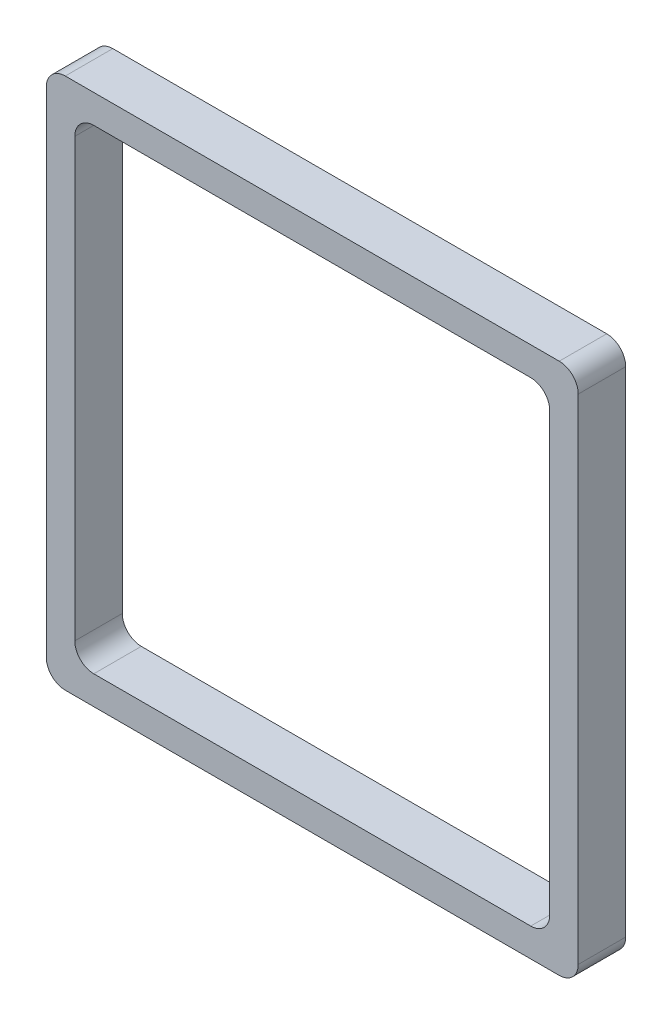
ISO-10303-21;
HEADER;
FILE_DESCRIPTION(('STEP AP214'),'2;1');
FILE_NAME('part.step','',(''),(''),'','','');
FILE_SCHEMA(('AUTOMOTIVE_DESIGN { 1 0 10303 214 1 1 1 1 }'));
ENDSEC;
DATA;
#1=APPLICATION_CONTEXT('core data for automotive mechanical design processes');
#2=APPLICATION_PROTOCOL_DEFINITION('international standard','automotive_design',2000,#1);
#3=PRODUCT_CONTEXT('',#1,'mechanical');
#4=PRODUCT('Part','Part','',(#3));
#5=PRODUCT_RELATED_PRODUCT_CATEGORY('part','',(#4));
#6=PRODUCT_DEFINITION_FORMATION('','',#4);
#7=PRODUCT_DEFINITION_CONTEXT('part definition',#1,'design');
#8=PRODUCT_DEFINITION('design','',#6,#7);
#9=PRODUCT_DEFINITION_SHAPE('','',#8);
#10=(LENGTH_UNIT() NAMED_UNIT(*) SI_UNIT(.MILLI.,.METRE.));
#11=(NAMED_UNIT(*) PLANE_ANGLE_UNIT() SI_UNIT($,.RADIAN.));
#12=(NAMED_UNIT(*) SI_UNIT($,.STERADIAN.) SOLID_ANGLE_UNIT());
#13=UNCERTAINTY_MEASURE_WITH_UNIT(LENGTH_MEASURE(1.E-05),#10,'distance_accuracy_value','');
#14=(GEOMETRIC_REPRESENTATION_CONTEXT(3) GLOBAL_UNCERTAINTY_ASSIGNED_CONTEXT((#13)) GLOBAL_UNIT_ASSIGNED_CONTEXT((#10,
#11,#12)) REPRESENTATION_CONTEXT('',''));
#15=CARTESIAN_POINT('',(0.,0.,0.));
#16=DIRECTION('',(0.,0.,1.));
#17=DIRECTION('',(1.,0.,0.));
#18=AXIS2_PLACEMENT_3D('',#15,#16,#17);
#19=CARTESIAN_POINT('',(26.,26.,5.));
#20=DIRECTION('',(0.,0.,-1.));
#21=DIRECTION('',(-1.,0.,0.));
#22=AXIS2_PLACEMENT_3D('',#19,#20,#21);
#23=PLANE('',#22);
#24=CARTESIAN_POINT('',(26.,26.,5.));
#25=DIRECTION('',(0.,0.,1.));
#26=DIRECTION('',(-1.,0.,0.));
#27=AXIS2_PLACEMENT_3D('',#24,#25,#26);
#28=CIRCLE('',#27,1.99999999999999);
#29=CARTESIAN_POINT('',(28.,26.,5.));
#30=VERTEX_POINT('',#29);
#31=CARTESIAN_POINT('',(26.,28.,5.));
#32=VERTEX_POINT('',#31);
#33=EDGE_CURVE('E213',#30,#32,#28,.T.);
#34=ORIENTED_EDGE('',*,*,#33,.T.);
#35=DIRECTION('',(-1.,0.,0.));
#36=VECTOR('',#35,1.);
#37=CARTESIAN_POINT('',(26.,28.,5.));
#38=LINE('',#37,#36);
#39=CARTESIAN_POINT('',(-26.,28.,5.));
#40=VERTEX_POINT('',#39);
#41=EDGE_CURVE('E216',#32,#40,#38,.T.);
#42=ORIENTED_EDGE('',*,*,#41,.T.);
#43=CARTESIAN_POINT('',(-26.,26.,5.));
#44=DIRECTION('',(0.,0.,1.));
#45=DIRECTION('',(-1.,0.,0.));
#46=AXIS2_PLACEMENT_3D('',#43,#44,#45);
#47=CIRCLE('',#46,2.);
#48=CARTESIAN_POINT('',(-28.,26.,5.));
#49=VERTEX_POINT('',#48);
#50=EDGE_CURVE('E219',#40,#49,#47,.T.);
#51=ORIENTED_EDGE('',*,*,#50,.T.);
#52=DIRECTION('',(0.,-1.,0.));
#53=VECTOR('',#52,1.);
#54=CARTESIAN_POINT('',(-28.,-26.,5.));
#55=LINE('',#54,#53);
#56=CARTESIAN_POINT('',(-28.,-26.,5.));
#57=VERTEX_POINT('',#56);
#58=EDGE_CURVE('E221',#49,#57,#55,.T.);
#59=ORIENTED_EDGE('',*,*,#58,.T.);
#60=CARTESIAN_POINT('',(-26.,-26.,5.));
#61=DIRECTION('',(0.,0.,1.));
#62=DIRECTION('',(-1.,0.,0.));
#63=AXIS2_PLACEMENT_3D('',#60,#61,#62);
#64=CIRCLE('',#63,2.);
#65=CARTESIAN_POINT('',(-26.,-28.,5.));
#66=VERTEX_POINT('',#65);
#67=EDGE_CURVE('E223',#57,#66,#64,.T.);
#68=ORIENTED_EDGE('',*,*,#67,.T.);
#69=DIRECTION('',(1.,0.,0.));
#70=VECTOR('',#69,1.);
#71=CARTESIAN_POINT('',(26.,-28.,5.));
#72=LINE('',#71,#70);
#73=CARTESIAN_POINT('',(26.,-28.,5.));
#74=VERTEX_POINT('',#73);
#75=EDGE_CURVE('E225',#66,#74,#72,.T.);
#76=ORIENTED_EDGE('',*,*,#75,.T.);
#77=CARTESIAN_POINT('',(26.,-26.,5.));
#78=DIRECTION('',(0.,0.,1.));
#79=DIRECTION('',(-1.,0.,0.));
#80=AXIS2_PLACEMENT_3D('',#77,#78,#79);
#81=CIRCLE('',#80,2.);
#82=CARTESIAN_POINT('',(28.,-26.,5.));
#83=VERTEX_POINT('',#82);
#84=EDGE_CURVE('E227',#74,#83,#81,.T.);
#85=ORIENTED_EDGE('',*,*,#84,.T.);
#86=DIRECTION('',(0.,1.,0.));
#87=VECTOR('',#86,1.);
#88=CARTESIAN_POINT('',(28.,-26.,5.));
#89=LINE('',#88,#87);
#90=EDGE_CURVE('E229',#83,#30,#89,.T.);
#91=ORIENTED_EDGE('',*,*,#90,.T.);
#92=EDGE_LOOP('',(#34,#42,#51,#59,#68,#76,#85,#91));
#93=FACE_BOUND('',#92,.T.);
#94=CARTESIAN_POINT('',(23.,-23.,5.));
#95=DIRECTION('',(0.,0.,1.));
#96=DIRECTION('',(-1.,0.,0.));
#97=AXIS2_PLACEMENT_3D('',#94,#95,#96);
#98=CIRCLE('',#97,2.);
#99=CARTESIAN_POINT('',(23.,-25.,5.));
#100=VERTEX_POINT('',#99);
#101=CARTESIAN_POINT('',(25.,-23.,5.));
#102=VERTEX_POINT('',#101);
#103=EDGE_CURVE('E148',#100,#102,#98,.T.);
#104=ORIENTED_EDGE('',*,*,#103,.F.);
#105=DIRECTION('',(1.,0.,0.));
#106=VECTOR('',#105,1.);
#107=CARTESIAN_POINT('',(23.,-25.,5.));
#108=LINE('',#107,#106);
#109=CARTESIAN_POINT('',(-23.,-25.,5.));
#110=VERTEX_POINT('',#109);
#111=EDGE_CURVE('E181',#110,#100,#108,.T.);
#112=ORIENTED_EDGE('',*,*,#111,.F.);
#113=CARTESIAN_POINT('',(-23.,-23.,5.));
#114=DIRECTION('',(0.,0.,1.));
#115=DIRECTION('',(-1.,0.,0.));
#116=AXIS2_PLACEMENT_3D('',#113,#114,#115);
#117=CIRCLE('',#116,2.);
#118=CARTESIAN_POINT('',(-25.,-23.,5.));
#119=VERTEX_POINT('',#118);
#120=EDGE_CURVE('E179',#119,#110,#117,.T.);
#121=ORIENTED_EDGE('',*,*,#120,.F.);
#122=DIRECTION('',(0.,-1.,0.));
#123=VECTOR('',#122,1.);
#124=CARTESIAN_POINT('',(-25.,-23.,5.));
#125=LINE('',#124,#123);
#126=CARTESIAN_POINT('',(-25.,23.,5.));
#127=VERTEX_POINT('',#126);
#128=EDGE_CURVE('E177',#127,#119,#125,.T.);
#129=ORIENTED_EDGE('',*,*,#128,.F.);
#130=CARTESIAN_POINT('',(-23.,23.,5.));
#131=DIRECTION('',(0.,0.,1.));
#132=DIRECTION('',(1.,0.,0.));
#133=AXIS2_PLACEMENT_3D('',#130,#131,#132);
#134=CIRCLE('',#133,2.);
#135=CARTESIAN_POINT('',(-23.,25.,5.));
#136=VERTEX_POINT('',#135);
#137=EDGE_CURVE('E175',#136,#127,#134,.T.);
#138=ORIENTED_EDGE('',*,*,#137,.F.);
#139=DIRECTION('',(-1.,0.,0.));
#140=VECTOR('',#139,1.);
#141=CARTESIAN_POINT('',(23.,25.,5.));
#142=LINE('',#141,#140);
#143=CARTESIAN_POINT('',(23.,25.,5.));
#144=VERTEX_POINT('',#143);
#145=EDGE_CURVE('E171',#144,#136,#142,.T.);
#146=ORIENTED_EDGE('',*,*,#145,.F.);
#147=CARTESIAN_POINT('',(23.,23.,5.));
#148=DIRECTION('',(0.,0.,1.));
#149=DIRECTION('',(-1.,0.,0.));
#150=AXIS2_PLACEMENT_3D('',#147,#148,#149);
#151=CIRCLE('',#150,2.);
#152=CARTESIAN_POINT('',(25.,23.,5.));
#153=VERTEX_POINT('',#152);
#154=EDGE_CURVE('E169',#153,#144,#151,.T.);
#155=ORIENTED_EDGE('',*,*,#154,.F.);
#156=DIRECTION('',(0.,1.,0.));
#157=VECTOR('',#156,1.);
#158=CARTESIAN_POINT('',(25.,-23.,5.));
#159=LINE('',#158,#157);
#160=EDGE_CURVE('E156',#102,#153,#159,.T.);
#161=ORIENTED_EDGE('',*,*,#160,.F.);
#162=EDGE_LOOP('',(#104,#112,#121,#129,#138,#146,#155,#161));
#163=FACE_BOUND('',#162,.T.);
#164=ADVANCED_FACE('F35',(#93,#163),#23,.F.);
#165=CARTESIAN_POINT('',(26.,26.,0.));
#166=DIRECTION('',(0.,0.,-1.));
#167=DIRECTION('',(-1.,0.,0.));
#168=AXIS2_PLACEMENT_3D('',#165,#166,#167);
#169=PLANE('',#168);
#170=CARTESIAN_POINT('',(26.,26.,0.));
#171=DIRECTION('',(0.,0.,1.));
#172=DIRECTION('',(-1.,0.,0.));
#173=AXIS2_PLACEMENT_3D('',#170,#171,#172);
#174=CIRCLE('',#173,1.99999999999999);
#175=CARTESIAN_POINT('',(28.,26.,0.));
#176=VERTEX_POINT('',#175);
#177=CARTESIAN_POINT('',(26.,28.,0.));
#178=VERTEX_POINT('',#177);
#179=EDGE_CURVE('E164',#176,#178,#174,.T.);
#180=ORIENTED_EDGE('',*,*,#179,.F.);
#181=DIRECTION('',(0.,1.,0.));
#182=VECTOR('',#181,1.);
#183=CARTESIAN_POINT('',(28.,-26.,0.));
#184=LINE('',#183,#182);
#185=CARTESIAN_POINT('',(28.,-26.,0.));
#186=VERTEX_POINT('',#185);
#187=EDGE_CURVE('E217',#186,#176,#184,.T.);
#188=ORIENTED_EDGE('',*,*,#187,.F.);
#189=CARTESIAN_POINT('',(26.,-26.,0.));
#190=DIRECTION('',(0.,0.,1.));
#191=DIRECTION('',(-1.,0.,0.));
#192=AXIS2_PLACEMENT_3D('',#189,#190,#191);
#193=CIRCLE('',#192,2.);
#194=CARTESIAN_POINT('',(26.,-28.,0.));
#195=VERTEX_POINT('',#194);
#196=EDGE_CURVE('E244',#195,#186,#193,.T.);
#197=ORIENTED_EDGE('',*,*,#196,.F.);
#198=DIRECTION('',(1.,0.,0.));
#199=VECTOR('',#198,1.);
#200=CARTESIAN_POINT('',(26.,-28.,0.));
#201=LINE('',#200,#199);
#202=CARTESIAN_POINT('',(-26.,-28.,0.));
#203=VERTEX_POINT('',#202);
#204=EDGE_CURVE('E242',#203,#195,#201,.T.);
#205=ORIENTED_EDGE('',*,*,#204,.F.);
#206=CARTESIAN_POINT('',(-26.,-26.,0.));
#207=DIRECTION('',(0.,0.,1.));
#208=DIRECTION('',(-1.,0.,0.));
#209=AXIS2_PLACEMENT_3D('',#206,#207,#208);
#210=CIRCLE('',#209,2.);
#211=CARTESIAN_POINT('',(-28.,-26.,0.));
#212=VERTEX_POINT('',#211);
#213=EDGE_CURVE('E240',#212,#203,#210,.T.);
#214=ORIENTED_EDGE('',*,*,#213,.F.);
#215=DIRECTION('',(0.,-1.,0.));
#216=VECTOR('',#215,1.);
#217=CARTESIAN_POINT('',(-28.,-26.,0.));
#218=LINE('',#217,#216);
#219=CARTESIAN_POINT('',(-28.,26.,0.));
#220=VERTEX_POINT('',#219);
#221=EDGE_CURVE('E238',#220,#212,#218,.T.);
#222=ORIENTED_EDGE('',*,*,#221,.F.);
#223=CARTESIAN_POINT('',(-26.,26.,0.));
#224=DIRECTION('',(0.,0.,1.));
#225=DIRECTION('',(-1.,0.,0.));
#226=AXIS2_PLACEMENT_3D('',#223,#224,#225);
#227=CIRCLE('',#226,2.);
#228=CARTESIAN_POINT('',(-26.,28.,0.));
#229=VERTEX_POINT('',#228);
#230=EDGE_CURVE('E236',#229,#220,#227,.T.);
#231=ORIENTED_EDGE('',*,*,#230,.F.);
#232=DIRECTION('',(-1.,0.,0.));
#233=VECTOR('',#232,1.);
#234=CARTESIAN_POINT('',(26.,28.,0.));
#235=LINE('',#234,#233);
#236=EDGE_CURVE('E234',#178,#229,#235,.T.);
#237=ORIENTED_EDGE('',*,*,#236,.F.);
#238=EDGE_LOOP('',(#180,#188,#197,#205,#214,#222,#231,#237));
#239=FACE_BOUND('',#238,.T.);
#240=DIRECTION('',(1.,0.,0.));
#241=VECTOR('',#240,1.);
#242=CARTESIAN_POINT('',(23.,-25.,0.));
#243=LINE('',#242,#241);
#244=CARTESIAN_POINT('',(-23.,-25.,0.));
#245=VERTEX_POINT('',#244);
#246=CARTESIAN_POINT('',(23.,-25.,0.));
#247=VERTEX_POINT('',#246);
#248=EDGE_CURVE('E157',#245,#247,#243,.T.);
#249=ORIENTED_EDGE('',*,*,#248,.T.);
#250=CARTESIAN_POINT('',(23.,-23.,0.));
#251=DIRECTION('',(0.,0.,1.));
#252=DIRECTION('',(-1.,0.,0.));
#253=AXIS2_PLACEMENT_3D('',#250,#251,#252);
#254=CIRCLE('',#253,2.);
#255=CARTESIAN_POINT('',(25.,-23.,0.));
#256=VERTEX_POINT('',#255);
#257=EDGE_CURVE('E58',#247,#256,#254,.T.);
#258=ORIENTED_EDGE('',*,*,#257,.T.);
#259=DIRECTION('',(0.,1.,0.));
#260=VECTOR('',#259,1.);
#261=CARTESIAN_POINT('',(25.,-23.,0.));
#262=LINE('',#261,#260);
#263=CARTESIAN_POINT('',(25.,23.,0.));
#264=VERTEX_POINT('',#263);
#265=EDGE_CURVE('E163',#256,#264,#262,.T.);
#266=ORIENTED_EDGE('',*,*,#265,.T.);
#267=CARTESIAN_POINT('',(23.,23.,0.));
#268=DIRECTION('',(0.,0.,1.));
#269=DIRECTION('',(-1.,0.,0.));
#270=AXIS2_PLACEMENT_3D('',#267,#268,#269);
#271=CIRCLE('',#270,2.);
#272=CARTESIAN_POINT('',(23.,25.,0.));
#273=VERTEX_POINT('',#272);
#274=EDGE_CURVE('E185',#264,#273,#271,.T.);
#275=ORIENTED_EDGE('',*,*,#274,.T.);
#276=DIRECTION('',(-1.,0.,0.));
#277=VECTOR('',#276,1.);
#278=CARTESIAN_POINT('',(23.,25.,0.));
#279=LINE('',#278,#277);
#280=CARTESIAN_POINT('',(-23.,25.,0.));
#281=VERTEX_POINT('',#280);
#282=EDGE_CURVE('E188',#273,#281,#279,.T.);
#283=ORIENTED_EDGE('',*,*,#282,.T.);
#284=CARTESIAN_POINT('',(-23.,23.,0.));
#285=DIRECTION('',(0.,0.,1.));
#286=DIRECTION('',(1.,0.,0.));
#287=AXIS2_PLACEMENT_3D('',#284,#285,#286);
#288=CIRCLE('',#287,2.);
#289=CARTESIAN_POINT('',(-25.,23.,0.));
#290=VERTEX_POINT('',#289);
#291=EDGE_CURVE('E191',#281,#290,#288,.T.);
#292=ORIENTED_EDGE('',*,*,#291,.T.);
#293=DIRECTION('',(0.,-1.,0.));
#294=VECTOR('',#293,1.);
#295=CARTESIAN_POINT('',(-25.,-23.,0.));
#296=LINE('',#295,#294);
#297=CARTESIAN_POINT('',(-25.,-23.,0.));
#298=VERTEX_POINT('',#297);
#299=EDGE_CURVE('E194',#290,#298,#296,.T.);
#300=ORIENTED_EDGE('',*,*,#299,.T.);
#301=CARTESIAN_POINT('',(-23.,-23.,0.));
#302=DIRECTION('',(0.,0.,1.));
#303=DIRECTION('',(-1.,0.,0.));
#304=AXIS2_PLACEMENT_3D('',#301,#302,#303);
#305=CIRCLE('',#304,2.);
#306=EDGE_CURVE('E197',#298,#245,#305,.T.);
#307=ORIENTED_EDGE('',*,*,#306,.T.);
#308=EDGE_LOOP('',(#249,#258,#266,#275,#283,#292,#300,#307));
#309=FACE_BOUND('',#308,.T.);
#310=ADVANCED_FACE('F274',(#239,#309),#169,.T.);
#311=CARTESIAN_POINT('',(26.,26.,5.));
#312=DIRECTION('',(0.,0.,-1.));
#313=DIRECTION('',(-1.,0.,0.));
#314=AXIS2_PLACEMENT_3D('',#311,#312,#313);
#315=CYLINDRICAL_SURFACE('',#314,1.99999999999999);
#316=ORIENTED_EDGE('',*,*,#179,.T.);
#317=DIRECTION('',(0.,0.,-1.));
#318=VECTOR('',#317,1.);
#319=CARTESIAN_POINT('',(26.,28.,5.));
#320=LINE('',#319,#318);
#321=EDGE_CURVE('E11',#32,#178,#320,.T.);
#322=ORIENTED_EDGE('',*,*,#321,.F.);
#323=ORIENTED_EDGE('',*,*,#33,.F.);
#324=DIRECTION('',(0.,0.,-1.));
#325=VECTOR('',#324,1.);
#326=CARTESIAN_POINT('',(28.,26.,5.));
#327=LINE('',#326,#325);
#328=EDGE_CURVE('E231',#30,#176,#327,.T.);
#329=ORIENTED_EDGE('',*,*,#328,.T.);
#330=EDGE_LOOP('',(#316,#322,#323,#329));
#331=FACE_BOUND('',#330,.T.);
#332=ADVANCED_FACE('F37',(#331),#315,.T.);
#333=CARTESIAN_POINT('',(26.,28.,5.));
#334=DIRECTION('',(0.,-1.,0.));
#335=DIRECTION('',(1.,0.,0.));
#336=AXIS2_PLACEMENT_3D('',#333,#334,#335);
#337=PLANE('',#336);
#338=ORIENTED_EDGE('',*,*,#236,.T.);
#339=DIRECTION('',(0.,0.,-1.));
#340=VECTOR('',#339,1.);
#341=CARTESIAN_POINT('',(-26.,28.,5.));
#342=LINE('',#341,#340);
#343=EDGE_CURVE('E43',#40,#229,#342,.T.);
#344=ORIENTED_EDGE('',*,*,#343,.F.);
#345=ORIENTED_EDGE('',*,*,#41,.F.);
#346=ORIENTED_EDGE('',*,*,#321,.T.);
#347=EDGE_LOOP('',(#338,#344,#345,#346));
#348=FACE_BOUND('',#347,.T.);
#349=ADVANCED_FACE('F291',(#348),#337,.F.);
#350=CARTESIAN_POINT('',(-26.,26.,5.));
#351=DIRECTION('',(0.,0.,-1.));
#352=DIRECTION('',(-1.,0.,0.));
#353=AXIS2_PLACEMENT_3D('',#350,#351,#352);
#354=CYLINDRICAL_SURFACE('',#353,2.);
#355=ORIENTED_EDGE('',*,*,#230,.T.);
#356=DIRECTION('',(0.,0.,-1.));
#357=VECTOR('',#356,1.);
#358=CARTESIAN_POINT('',(-28.,26.,5.));
#359=LINE('',#358,#357);
#360=EDGE_CURVE('E261',#49,#220,#359,.T.);
#361=ORIENTED_EDGE('',*,*,#360,.F.);
#362=ORIENTED_EDGE('',*,*,#50,.F.);
#363=ORIENTED_EDGE('',*,*,#343,.T.);
#364=EDGE_LOOP('',(#355,#361,#362,#363));
#365=FACE_BOUND('',#364,.T.);
#366=ADVANCED_FACE('F268',(#365),#354,.T.);
#367=CARTESIAN_POINT('',(-28.,-26.,5.));
#368=DIRECTION('',(1.,0.,0.));
#369=DIRECTION('',(0.,0.,-1.));
#370=AXIS2_PLACEMENT_3D('',#367,#368,#369);
#371=PLANE('',#370);
#372=ORIENTED_EDGE('',*,*,#221,.T.);
#373=DIRECTION('',(0.,0.,-1.));
#374=VECTOR('',#373,1.);
#375=CARTESIAN_POINT('',(-28.,-26.,5.));
#376=LINE('',#375,#374);
#377=EDGE_CURVE('E258',#57,#212,#376,.T.);
#378=ORIENTED_EDGE('',*,*,#377,.F.);
#379=ORIENTED_EDGE('',*,*,#58,.F.);
#380=ORIENTED_EDGE('',*,*,#360,.T.);
#381=EDGE_LOOP('',(#372,#378,#379,#380));
#382=FACE_BOUND('',#381,.T.);
#383=ADVANCED_FACE('F280',(#382),#371,.F.);
#384=CARTESIAN_POINT('',(-26.,-26.,5.));
#385=DIRECTION('',(0.,0.,-1.));
#386=DIRECTION('',(-1.,0.,0.));
#387=AXIS2_PLACEMENT_3D('',#384,#385,#386);
#388=CYLINDRICAL_SURFACE('',#387,2.);
#389=ORIENTED_EDGE('',*,*,#213,.T.);
#390=DIRECTION('',(0.,0.,-1.));
#391=VECTOR('',#390,1.);
#392=CARTESIAN_POINT('',(-26.,-28.,5.));
#393=LINE('',#392,#391);
#394=EDGE_CURVE('E255',#66,#203,#393,.T.);
#395=ORIENTED_EDGE('',*,*,#394,.F.);
#396=ORIENTED_EDGE('',*,*,#67,.F.);
#397=ORIENTED_EDGE('',*,*,#377,.T.);
#398=EDGE_LOOP('',(#389,#395,#396,#397));
#399=FACE_BOUND('',#398,.T.);
#400=ADVANCED_FACE('F284',(#399),#388,.T.);
#401=CARTESIAN_POINT('',(26.,-28.,5.));
#402=DIRECTION('',(0.,1.,0.));
#403=DIRECTION('',(0.,0.,1.));
#404=AXIS2_PLACEMENT_3D('',#401,#402,#403);
#405=PLANE('',#404);
#406=ORIENTED_EDGE('',*,*,#204,.T.);
#407=DIRECTION('',(0.,0.,-1.));
#408=VECTOR('',#407,1.);
#409=CARTESIAN_POINT('',(26.,-28.,5.));
#410=LINE('',#409,#408);
#411=EDGE_CURVE('E252',#74,#195,#410,.T.);
#412=ORIENTED_EDGE('',*,*,#411,.F.);
#413=ORIENTED_EDGE('',*,*,#75,.F.);
#414=ORIENTED_EDGE('',*,*,#394,.T.);
#415=EDGE_LOOP('',(#406,#412,#413,#414));
#416=FACE_BOUND('',#415,.T.);
#417=ADVANCED_FACE('F304',(#416),#405,.F.);
#418=CARTESIAN_POINT('',(26.,-26.,5.));
#419=DIRECTION('',(0.,0.,-1.));
#420=DIRECTION('',(-1.,0.,0.));
#421=AXIS2_PLACEMENT_3D('',#418,#419,#420);
#422=CYLINDRICAL_SURFACE('',#421,2.);
#423=ORIENTED_EDGE('',*,*,#196,.T.);
#424=DIRECTION('',(0.,0.,-1.));
#425=VECTOR('',#424,1.);
#426=CARTESIAN_POINT('',(28.,-26.,5.));
#427=LINE('',#426,#425);
#428=EDGE_CURVE('E249',#83,#186,#427,.T.);
#429=ORIENTED_EDGE('',*,*,#428,.F.);
#430=ORIENTED_EDGE('',*,*,#84,.F.);
#431=ORIENTED_EDGE('',*,*,#411,.T.);
#432=EDGE_LOOP('',(#423,#429,#430,#431));
#433=FACE_BOUND('',#432,.T.);
#434=ADVANCED_FACE('F302',(#433),#422,.T.);
#435=CARTESIAN_POINT('',(28.,-26.,5.));
#436=DIRECTION('',(-1.,0.,0.));
#437=DIRECTION('',(0.,0.,1.));
#438=AXIS2_PLACEMENT_3D('',#435,#436,#437);
#439=PLANE('',#438);
#440=ORIENTED_EDGE('',*,*,#187,.T.);
#441=ORIENTED_EDGE('',*,*,#328,.F.);
#442=ORIENTED_EDGE('',*,*,#90,.F.);
#443=ORIENTED_EDGE('',*,*,#428,.T.);
#444=EDGE_LOOP('',(#440,#441,#442,#443));
#445=FACE_BOUND('',#444,.T.);
#446=ADVANCED_FACE('F297',(#445),#439,.F.);
#447=CARTESIAN_POINT('',(23.,-23.,5.));
#448=DIRECTION('',(0.,0.,-1.));
#449=DIRECTION('',(-1.,0.,0.));
#450=AXIS2_PLACEMENT_3D('',#447,#448,#449);
#451=CYLINDRICAL_SURFACE('',#450,2.);
#452=ORIENTED_EDGE('',*,*,#257,.F.);
#453=DIRECTION('',(0.,0.,-1.));
#454=VECTOR('',#453,1.);
#455=CARTESIAN_POINT('',(23.,-25.,5.));
#456=LINE('',#455,#454);
#457=EDGE_CURVE('E152',#100,#247,#456,.T.);
#458=ORIENTED_EDGE('',*,*,#457,.F.);
#459=ORIENTED_EDGE('',*,*,#103,.T.);
#460=DIRECTION('',(0.,0.,-1.));
#461=VECTOR('',#460,1.);
#462=CARTESIAN_POINT('',(25.,-23.,5.));
#463=LINE('',#462,#461);
#464=EDGE_CURVE('E151',#102,#256,#463,.T.);
#465=ORIENTED_EDGE('',*,*,#464,.T.);
#466=EDGE_LOOP('',(#452,#458,#459,#465));
#467=FACE_BOUND('',#466,.T.);
#468=ADVANCED_FACE('F150',(#467),#451,.F.);
#469=CARTESIAN_POINT('',(25.,-23.,5.));
#470=DIRECTION('',(-1.,0.,0.));
#471=DIRECTION('',(0.,0.,1.));
#472=AXIS2_PLACEMENT_3D('',#469,#470,#471);
#473=PLANE('',#472);
#474=ORIENTED_EDGE('',*,*,#265,.F.);
#475=ORIENTED_EDGE('',*,*,#464,.F.);
#476=ORIENTED_EDGE('',*,*,#160,.T.);
#477=DIRECTION('',(0.,0.,-1.));
#478=VECTOR('',#477,1.);
#479=CARTESIAN_POINT('',(25.,23.,5.));
#480=LINE('',#479,#478);
#481=EDGE_CURVE('E165',#153,#264,#480,.T.);
#482=ORIENTED_EDGE('',*,*,#481,.T.);
#483=EDGE_LOOP('',(#474,#475,#476,#482));
#484=FACE_BOUND('',#483,.T.);
#485=ADVANCED_FACE('F160',(#484),#473,.T.);
#486=CARTESIAN_POINT('',(23.,23.,5.));
#487=DIRECTION('',(0.,0.,-1.));
#488=DIRECTION('',(-1.,0.,0.));
#489=AXIS2_PLACEMENT_3D('',#486,#487,#488);
#490=CYLINDRICAL_SURFACE('',#489,2.);
#491=ORIENTED_EDGE('',*,*,#274,.F.);
#492=ORIENTED_EDGE('',*,*,#481,.F.);
#493=ORIENTED_EDGE('',*,*,#154,.T.);
#494=DIRECTION('',(0.,0.,-1.));
#495=VECTOR('',#494,1.);
#496=CARTESIAN_POINT('',(23.,25.,5.));
#497=LINE('',#496,#495);
#498=EDGE_CURVE('E210',#144,#273,#497,.T.);
#499=ORIENTED_EDGE('',*,*,#498,.T.);
#500=EDGE_LOOP('',(#491,#492,#493,#499));
#501=FACE_BOUND('',#500,.T.);
#502=ADVANCED_FACE('F329',(#501),#490,.F.);
#503=CARTESIAN_POINT('',(23.,25.,5.));
#504=DIRECTION('',(0.,-1.,0.));
#505=DIRECTION('',(1.,0.,0.));
#506=AXIS2_PLACEMENT_3D('',#503,#504,#505);
#507=PLANE('',#506);
#508=ORIENTED_EDGE('',*,*,#282,.F.);
#509=ORIENTED_EDGE('',*,*,#498,.F.);
#510=ORIENTED_EDGE('',*,*,#145,.T.);
#511=DIRECTION('',(0.,0.,-1.));
#512=VECTOR('',#511,1.);
#513=CARTESIAN_POINT('',(-23.,25.,5.));
#514=LINE('',#513,#512);
#515=EDGE_CURVE('E208',#136,#281,#514,.T.);
#516=ORIENTED_EDGE('',*,*,#515,.T.);
#517=EDGE_LOOP('',(#508,#509,#510,#516));
#518=FACE_BOUND('',#517,.T.);
#519=ADVANCED_FACE('F333',(#518),#507,.T.);
#520=CARTESIAN_POINT('',(-23.,23.,5.));
#521=DIRECTION('',(0.,0.,-1.));
#522=DIRECTION('',(-1.,0.,0.));
#523=AXIS2_PLACEMENT_3D('',#520,#521,#522);
#524=CYLINDRICAL_SURFACE('',#523,2.);
#525=ORIENTED_EDGE('',*,*,#291,.F.);
#526=ORIENTED_EDGE('',*,*,#515,.F.);
#527=ORIENTED_EDGE('',*,*,#137,.T.);
#528=DIRECTION('',(0.,0.,-1.));
#529=VECTOR('',#528,1.);
#530=CARTESIAN_POINT('',(-25.,23.,5.));
#531=LINE('',#530,#529);
#532=EDGE_CURVE('E206',#127,#290,#531,.T.);
#533=ORIENTED_EDGE('',*,*,#532,.T.);
#534=EDGE_LOOP('',(#525,#526,#527,#533));
#535=FACE_BOUND('',#534,.T.);
#536=ADVANCED_FACE('F339',(#535),#524,.F.);
#537=CARTESIAN_POINT('',(-25.,-23.,5.));
#538=DIRECTION('',(1.,0.,0.));
#539=DIRECTION('',(0.,0.,-1.));
#540=AXIS2_PLACEMENT_3D('',#537,#538,#539);
#541=PLANE('',#540);
#542=ORIENTED_EDGE('',*,*,#299,.F.);
#543=ORIENTED_EDGE('',*,*,#532,.F.);
#544=ORIENTED_EDGE('',*,*,#128,.T.);
#545=DIRECTION('',(0.,0.,-1.));
#546=VECTOR('',#545,1.);
#547=CARTESIAN_POINT('',(-25.,-23.,5.));
#548=LINE('',#547,#546);
#549=EDGE_CURVE('E204',#119,#298,#548,.T.);
#550=ORIENTED_EDGE('',*,*,#549,.T.);
#551=EDGE_LOOP('',(#542,#543,#544,#550));
#552=FACE_BOUND('',#551,.T.);
#553=ADVANCED_FACE('F343',(#552),#541,.T.);
#554=CARTESIAN_POINT('',(-23.,-23.,5.));
#555=DIRECTION('',(0.,0.,-1.));
#556=DIRECTION('',(-1.,0.,0.));
#557=AXIS2_PLACEMENT_3D('',#554,#555,#556);
#558=CYLINDRICAL_SURFACE('',#557,2.);
#559=ORIENTED_EDGE('',*,*,#306,.F.);
#560=ORIENTED_EDGE('',*,*,#549,.F.);
#561=ORIENTED_EDGE('',*,*,#120,.T.);
#562=DIRECTION('',(0.,0.,-1.));
#563=VECTOR('',#562,1.);
#564=CARTESIAN_POINT('',(-23.,-25.,5.));
#565=LINE('',#564,#563);
#566=EDGE_CURVE('E50',#110,#245,#565,.T.);
#567=ORIENTED_EDGE('',*,*,#566,.T.);
#568=EDGE_LOOP('',(#559,#560,#561,#567));
#569=FACE_BOUND('',#568,.T.);
#570=ADVANCED_FACE('F347',(#569),#558,.F.);
#571=CARTESIAN_POINT('',(23.,-25.,5.));
#572=DIRECTION('',(0.,1.,0.));
#573=DIRECTION('',(-1.,0.,0.));
#574=AXIS2_PLACEMENT_3D('',#571,#572,#573);
#575=PLANE('',#574);
#576=ORIENTED_EDGE('',*,*,#248,.F.);
#577=ORIENTED_EDGE('',*,*,#566,.F.);
#578=ORIENTED_EDGE('',*,*,#111,.T.);
#579=ORIENTED_EDGE('',*,*,#457,.T.);
#580=EDGE_LOOP('',(#576,#577,#578,#579));
#581=FACE_BOUND('',#580,.T.);
#582=ADVANCED_FACE('F351',(#581),#575,.T.);
#583=CLOSED_SHELL('',(#164,#310,#332,#349,#366,#383,#400,#417,#434,#446,#468,#485,#502,#519,
#536,#553,#570,#582));
#584=MANIFOLD_SOLID_BREP('B2',#583);
#585=ADVANCED_BREP_SHAPE_REPRESENTATION('',(#18,#584),#14);
#586=SHAPE_DEFINITION_REPRESENTATION(#9,#585);
ENDSEC;
END-ISO-10303-21;
